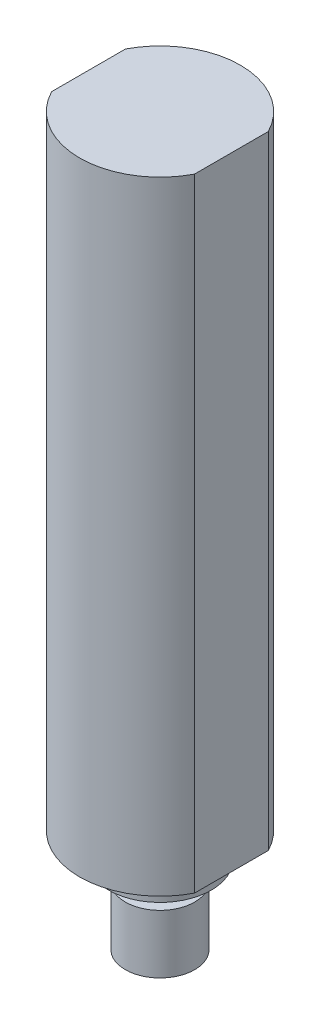
ISO-10303-21;
HEADER;
FILE_DESCRIPTION(('STEP AP214'),'2;1');
FILE_NAME('part.step','',(''),(''),'','','');
FILE_SCHEMA(('AUTOMOTIVE_DESIGN { 1 0 10303 214 1 1 1 1 }'));
ENDSEC;
DATA;
#1=APPLICATION_CONTEXT('core data for automotive mechanical design processes');
#2=APPLICATION_PROTOCOL_DEFINITION('international standard','automotive_design',2000,#1);
#3=PRODUCT_CONTEXT('',#1,'mechanical');
#4=PRODUCT('Part','Part','',(#3));
#5=PRODUCT_RELATED_PRODUCT_CATEGORY('part','',(#4));
#6=PRODUCT_DEFINITION_FORMATION('','',#4);
#7=PRODUCT_DEFINITION_CONTEXT('part definition',#1,'design');
#8=PRODUCT_DEFINITION('design','',#6,#7);
#9=PRODUCT_DEFINITION_SHAPE('','',#8);
#10=(LENGTH_UNIT() NAMED_UNIT(*) SI_UNIT(.MILLI.,.METRE.));
#11=(NAMED_UNIT(*) PLANE_ANGLE_UNIT() SI_UNIT($,.RADIAN.));
#12=(NAMED_UNIT(*) SI_UNIT($,.STERADIAN.) SOLID_ANGLE_UNIT());
#13=UNCERTAINTY_MEASURE_WITH_UNIT(LENGTH_MEASURE(1.E-05),#10,'distance_accuracy_value','');
#14=(GEOMETRIC_REPRESENTATION_CONTEXT(3) GLOBAL_UNCERTAINTY_ASSIGNED_CONTEXT((#13)) GLOBAL_UNIT_ASSIGNED_CONTEXT((#10,
#11,#12)) REPRESENTATION_CONTEXT('',''));
#15=CARTESIAN_POINT('',(0.,0.,0.));
#16=DIRECTION('',(0.,0.,1.));
#17=DIRECTION('',(1.,0.,0.));
#18=AXIS2_PLACEMENT_3D('',#15,#16,#17);
#19=CARTESIAN_POINT('',(0.,72.4545648908914,0.));
#20=DIRECTION('',(0.,1.,0.));
#21=DIRECTION('',(0.,0.,1.));
#22=AXIS2_PLACEMENT_3D('',#19,#20,#21);
#23=CYLINDRICAL_SURFACE('',#22,10.975);
#24=CARTESIAN_POINT('',(0.,14.08,0.));
#25=DIRECTION('',(0.,1.,0.));
#26=DIRECTION('',(0.,0.,1.));
#27=AXIS2_PLACEMENT_3D('',#24,#25,#26);
#28=CIRCLE('',#27,10.975);
#29=CARTESIAN_POINT('',(9.75,14.08,-5.03866301711078));
#30=VERTEX_POINT('',#29);
#31=CARTESIAN_POINT('',(-9.75,14.08,-5.03866301711078));
#32=VERTEX_POINT('',#31);
#33=EDGE_CURVE('E98',#30,#32,#28,.T.);
#34=ORIENTED_EDGE('',*,*,#33,.T.);
#35=DIRECTION('',(0.,1.,0.));
#36=VECTOR('',#35,1.);
#37=CARTESIAN_POINT('',(-9.75,0.,-5.03866301711078));
#38=LINE('',#37,#36);
#39=CARTESIAN_POINT('',(-9.75,99.08,-5.03866301711078));
#40=VERTEX_POINT('',#39);
#41=EDGE_CURVE('E84',#32,#40,#38,.T.);
#42=ORIENTED_EDGE('',*,*,#41,.T.);
#43=CARTESIAN_POINT('',(0.,99.08,0.));
#44=DIRECTION('',(0.,1.,0.));
#45=DIRECTION('',(0.,0.,1.));
#46=AXIS2_PLACEMENT_3D('',#43,#44,#45);
#47=CIRCLE('',#46,10.975);
#48=CARTESIAN_POINT('',(9.75,99.08,-5.03866301711078));
#49=VERTEX_POINT('',#48);
#50=EDGE_CURVE('E96',#49,#40,#47,.T.);
#51=ORIENTED_EDGE('',*,*,#50,.F.);
#52=DIRECTION('',(0.,1.,0.));
#53=VECTOR('',#52,1.);
#54=CARTESIAN_POINT('',(9.75,0.,-5.03866301711078));
#55=LINE('',#54,#53);
#56=EDGE_CURVE('E66',#30,#49,#55,.T.);
#57=ORIENTED_EDGE('',*,*,#56,.F.);
#58=EDGE_LOOP('',(#34,#42,#51,#57));
#59=FACE_BOUND('',#58,.T.);
#60=ADVANCED_FACE('F42',(#59),#23,.T.);
#61=CARTESIAN_POINT('',(0.,0.,0.));
#62=DIRECTION('',(0.,1.,0.));
#63=DIRECTION('',(0.,0.,1.));
#64=AXIS2_PLACEMENT_3D('',#61,#62,#63);
#65=PLANE('',#64);
#66=CARTESIAN_POINT('',(0.,0.,0.));
#67=DIRECTION('',(0.,1.,0.));
#68=DIRECTION('',(0.,0.,1.));
#69=AXIS2_PLACEMENT_3D('',#66,#67,#68);
#70=CIRCLE('',#69,4.74000000000001);
#71=CARTESIAN_POINT('',(0.,0.,4.74000000000001));
#72=VERTEX_POINT('',#71);
#73=EDGE_CURVE('E11',#72,#72,#70,.T.);
#74=ORIENTED_EDGE('',*,*,#73,.F.);
#75=EDGE_LOOP('',(#74));
#76=FACE_BOUND('',#75,.T.);
#77=ADVANCED_FACE('F44',(#76),#65,.F.);
#78=CARTESIAN_POINT('',(0.,72.4545648908914,0.));
#79=DIRECTION('',(0.,1.,0.));
#80=DIRECTION('',(0.,0.,1.));
#81=AXIS2_PLACEMENT_3D('',#78,#79,#80);
#82=CYLINDRICAL_SURFACE('',#81,4.74000000000001);
#83=CARTESIAN_POINT('',(0.,7.99999999999999,0.));
#84=DIRECTION('',(0.,1.,0.));
#85=DIRECTION('',(0.,0.,1.));
#86=AXIS2_PLACEMENT_3D('',#83,#84,#85);
#87=CIRCLE('',#86,4.74000000000001);
#88=CARTESIAN_POINT('',(0.,7.99999999999999,4.74000000000001));
#89=VERTEX_POINT('',#88);
#90=EDGE_CURVE('E51',#89,#89,#87,.T.);
#91=ORIENTED_EDGE('',*,*,#90,.F.);
#92=EDGE_LOOP('',(#91));
#93=FACE_BOUND('',#92,.T.);
#94=ORIENTED_EDGE('',*,*,#73,.T.);
#95=EDGE_LOOP('',(#94));
#96=FACE_BOUND('',#95,.T.);
#97=ADVANCED_FACE('F136',(#93,#96),#82,.T.);
#98=CARTESIAN_POINT('',(4.74000000000001,8.,0.));
#99=DIRECTION('',(0.,-1.,0.));
#100=DIRECTION('',(0.,0.,-1.));
#101=AXIS2_PLACEMENT_3D('',#98,#99,#100);
#102=PLANE('',#101);
#103=CARTESIAN_POINT('',(0.,7.99999999999999,0.));
#104=DIRECTION('',(0.,1.,0.));
#105=DIRECTION('',(0.,0.,1.));
#106=AXIS2_PLACEMENT_3D('',#103,#104,#105);
#107=CIRCLE('',#106,1.00000000000001);
#108=CARTESIAN_POINT('',(0.,7.99999999999999,1.00000000000001));
#109=VERTEX_POINT('',#108);
#110=EDGE_CURVE('E127',#109,#109,#107,.T.);
#111=ORIENTED_EDGE('',*,*,#110,.F.);
#112=EDGE_LOOP('',(#111));
#113=FACE_BOUND('',#112,.T.);
#114=ORIENTED_EDGE('',*,*,#90,.T.);
#115=EDGE_LOOP('',(#114));
#116=FACE_BOUND('',#115,.T.);
#117=ADVANCED_FACE('F134',(#113,#116),#102,.F.);
#118=CARTESIAN_POINT('',(0.,72.4545648908914,0.));
#119=DIRECTION('',(0.,1.,0.));
#120=DIRECTION('',(0.,0.,1.));
#121=AXIS2_PLACEMENT_3D('',#118,#119,#120);
#122=CYLINDRICAL_SURFACE('',#121,1.00000000000001);
#123=CARTESIAN_POINT('',(0.,10.53,0.));
#124=DIRECTION('',(0.,1.,0.));
#125=DIRECTION('',(0.,0.,1.));
#126=AXIS2_PLACEMENT_3D('',#123,#124,#125);
#127=CIRCLE('',#126,1.00000000000001);
#128=CARTESIAN_POINT('',(0.,10.53,1.00000000000001));
#129=VERTEX_POINT('',#128);
#130=EDGE_CURVE('E123',#129,#129,#127,.T.);
#131=ORIENTED_EDGE('',*,*,#130,.F.);
#132=EDGE_LOOP('',(#131));
#133=FACE_BOUND('',#132,.T.);
#134=ORIENTED_EDGE('',*,*,#110,.T.);
#135=EDGE_LOOP('',(#134));
#136=FACE_BOUND('',#135,.T.);
#137=ADVANCED_FACE('F186',(#133,#136),#122,.T.);
#138=CARTESIAN_POINT('',(1.00000000000001,10.53,0.));
#139=DIRECTION('',(0.,1.,0.));
#140=DIRECTION('',(0.,0.,1.));
#141=AXIS2_PLACEMENT_3D('',#138,#139,#140);
#142=PLANE('',#141);
#143=CARTESIAN_POINT('',(0.,10.53,0.));
#144=DIRECTION('',(0.,1.,0.));
#145=DIRECTION('',(0.,0.,1.));
#146=AXIS2_PLACEMENT_3D('',#143,#144,#145);
#147=CIRCLE('',#146,7.00000000000001);
#148=CARTESIAN_POINT('',(0.,10.53,7.00000000000001));
#149=VERTEX_POINT('',#148);
#150=EDGE_CURVE('E119',#149,#149,#147,.T.);
#151=ORIENTED_EDGE('',*,*,#150,.F.);
#152=EDGE_LOOP('',(#151));
#153=FACE_BOUND('',#152,.T.);
#154=ORIENTED_EDGE('',*,*,#130,.T.);
#155=EDGE_LOOP('',(#154));
#156=FACE_BOUND('',#155,.T.);
#157=ADVANCED_FACE('F180',(#153,#156),#142,.F.);
#158=CARTESIAN_POINT('',(0.,72.4545648908914,0.));
#159=DIRECTION('',(0.,1.,0.));
#160=DIRECTION('',(0.,0.,1.));
#161=AXIS2_PLACEMENT_3D('',#158,#159,#160);
#162=CYLINDRICAL_SURFACE('',#161,7.00000000000001);
#163=CARTESIAN_POINT('',(0.,14.08,0.));
#164=DIRECTION('',(0.,1.,0.));
#165=DIRECTION('',(0.,0.,1.));
#166=AXIS2_PLACEMENT_3D('',#163,#164,#165);
#167=CIRCLE('',#166,7.00000000000001);
#168=CARTESIAN_POINT('',(0.,14.08,7.00000000000001));
#169=VERTEX_POINT('',#168);
#170=EDGE_CURVE('E115',#169,#169,#167,.T.);
#171=ORIENTED_EDGE('',*,*,#170,.F.);
#172=EDGE_LOOP('',(#171));
#173=FACE_BOUND('',#172,.T.);
#174=ORIENTED_EDGE('',*,*,#150,.T.);
#175=EDGE_LOOP('',(#174));
#176=FACE_BOUND('',#175,.T.);
#177=ADVANCED_FACE('F159',(#173,#176),#162,.T.);
#178=CARTESIAN_POINT('',(7.00000000000001,14.08,0.));
#179=DIRECTION('',(0.,1.,0.));
#180=DIRECTION('',(0.,0.,1.));
#181=AXIS2_PLACEMENT_3D('',#178,#179,#180);
#182=PLANE('',#181);
#183=CARTESIAN_POINT('',(-9.75,14.08,5.03866301711078));
#184=VERTEX_POINT('',#183);
#185=CARTESIAN_POINT('',(9.75,14.08,5.03866301711078));
#186=VERTEX_POINT('',#185);
#187=EDGE_CURVE('E104',#184,#186,#28,.T.);
#188=ORIENTED_EDGE('',*,*,#187,.F.);
#189=DIRECTION('',(0.,0.,-1.));
#190=VECTOR('',#189,1.);
#191=CARTESIAN_POINT('',(-9.75,14.08,0.));
#192=LINE('',#191,#190);
#193=EDGE_CURVE('E111',#184,#32,#192,.T.);
#194=ORIENTED_EDGE('',*,*,#193,.T.);
#195=ORIENTED_EDGE('',*,*,#33,.F.);
#196=DIRECTION('',(0.,0.,1.));
#197=VECTOR('',#196,1.);
#198=CARTESIAN_POINT('',(9.75,14.08,0.));
#199=LINE('',#198,#197);
#200=EDGE_CURVE('E100',#30,#186,#199,.T.);
#201=ORIENTED_EDGE('',*,*,#200,.T.);
#202=EDGE_LOOP('',(#188,#194,#195,#201));
#203=FACE_BOUND('',#202,.T.);
#204=ORIENTED_EDGE('',*,*,#170,.T.);
#205=EDGE_LOOP('',(#204));
#206=FACE_BOUND('',#205,.T.);
#207=ADVANCED_FACE('F152',(#203,#206),#182,.F.);
#208=CARTESIAN_POINT('',(-9.75,99.08,5.03866301711078));
#209=VERTEX_POINT('',#208);
#210=CARTESIAN_POINT('',(9.75,99.08,5.03866301711078));
#211=VERTEX_POINT('',#210);
#212=EDGE_CURVE('E105',#209,#211,#47,.T.);
#213=ORIENTED_EDGE('',*,*,#212,.F.);
#214=DIRECTION('',(0.,1.,0.));
#215=VECTOR('',#214,1.);
#216=CARTESIAN_POINT('',(-9.75,0.,5.03866301711078));
#217=LINE('',#216,#215);
#218=EDGE_CURVE('E58',#184,#209,#217,.T.);
#219=ORIENTED_EDGE('',*,*,#218,.F.);
#220=ORIENTED_EDGE('',*,*,#187,.T.);
#221=DIRECTION('',(0.,1.,0.));
#222=VECTOR('',#221,1.);
#223=CARTESIAN_POINT('',(9.75,0.,5.03866301711078));
#224=LINE('',#223,#222);
#225=EDGE_CURVE('E163',#186,#211,#224,.T.);
#226=ORIENTED_EDGE('',*,*,#225,.T.);
#227=EDGE_LOOP('',(#213,#219,#220,#226));
#228=FACE_BOUND('',#227,.T.);
#229=ADVANCED_FACE('F146',(#228),#23,.T.);
#230=CARTESIAN_POINT('',(10.975,99.08,0.));
#231=DIRECTION('',(0.,-1.,0.));
#232=DIRECTION('',(0.,0.,-1.));
#233=AXIS2_PLACEMENT_3D('',#230,#231,#232);
#234=PLANE('',#233);
#235=ORIENTED_EDGE('',*,*,#50,.T.);
#236=DIRECTION('',(0.,0.,-1.));
#237=VECTOR('',#236,1.);
#238=CARTESIAN_POINT('',(-9.75,99.08,-5.03866301711078));
#239=LINE('',#238,#237);
#240=EDGE_CURVE('E81',#209,#40,#239,.T.);
#241=ORIENTED_EDGE('',*,*,#240,.F.);
#242=ORIENTED_EDGE('',*,*,#212,.T.);
#243=DIRECTION('',(0.,0.,1.));
#244=VECTOR('',#243,1.);
#245=CARTESIAN_POINT('',(9.75,99.08,5.03866301711078));
#246=LINE('',#245,#244);
#247=EDGE_CURVE('E91',#49,#211,#246,.T.);
#248=ORIENTED_EDGE('',*,*,#247,.F.);
#249=EDGE_LOOP('',(#235,#241,#242,#248));
#250=FACE_BOUND('',#249,.T.);
#251=ADVANCED_FACE('F102',(#250),#234,.F.);
#252=CARTESIAN_POINT('',(9.75,0.,5.03866301711078));
#253=DIRECTION('',(-1.,0.,0.));
#254=DIRECTION('',(0.,0.,1.));
#255=AXIS2_PLACEMENT_3D('',#252,#253,#254);
#256=PLANE('',#255);
#257=ORIENTED_EDGE('',*,*,#56,.T.);
#258=ORIENTED_EDGE('',*,*,#247,.T.);
#259=ORIENTED_EDGE('',*,*,#225,.F.);
#260=ORIENTED_EDGE('',*,*,#200,.F.);
#261=EDGE_LOOP('',(#257,#258,#259,#260));
#262=FACE_BOUND('',#261,.T.);
#263=ADVANCED_FACE('F158',(#262),#256,.F.);
#264=CARTESIAN_POINT('',(-9.75,0.,-5.03866301711078));
#265=DIRECTION('',(1.,0.,0.));
#266=DIRECTION('',(0.,0.,-1.));
#267=AXIS2_PLACEMENT_3D('',#264,#265,#266);
#268=PLANE('',#267);
#269=ORIENTED_EDGE('',*,*,#218,.T.);
#270=ORIENTED_EDGE('',*,*,#240,.T.);
#271=ORIENTED_EDGE('',*,*,#41,.F.);
#272=ORIENTED_EDGE('',*,*,#193,.F.);
#273=EDGE_LOOP('',(#269,#270,#271,#272));
#274=FACE_BOUND('',#273,.T.);
#275=ADVANCED_FACE('F83',(#274),#268,.F.);
#276=CLOSED_SHELL('',(#60,#77,#97,#117,#137,#157,#177,#207,#229,#251,#263,#275));
#277=MANIFOLD_SOLID_BREP('B2',#276);
#278=ADVANCED_BREP_SHAPE_REPRESENTATION('',(#18,#277),#14);
#279=SHAPE_DEFINITION_REPRESENTATION(#9,#278);
ENDSEC;
END-ISO-10303-21;
